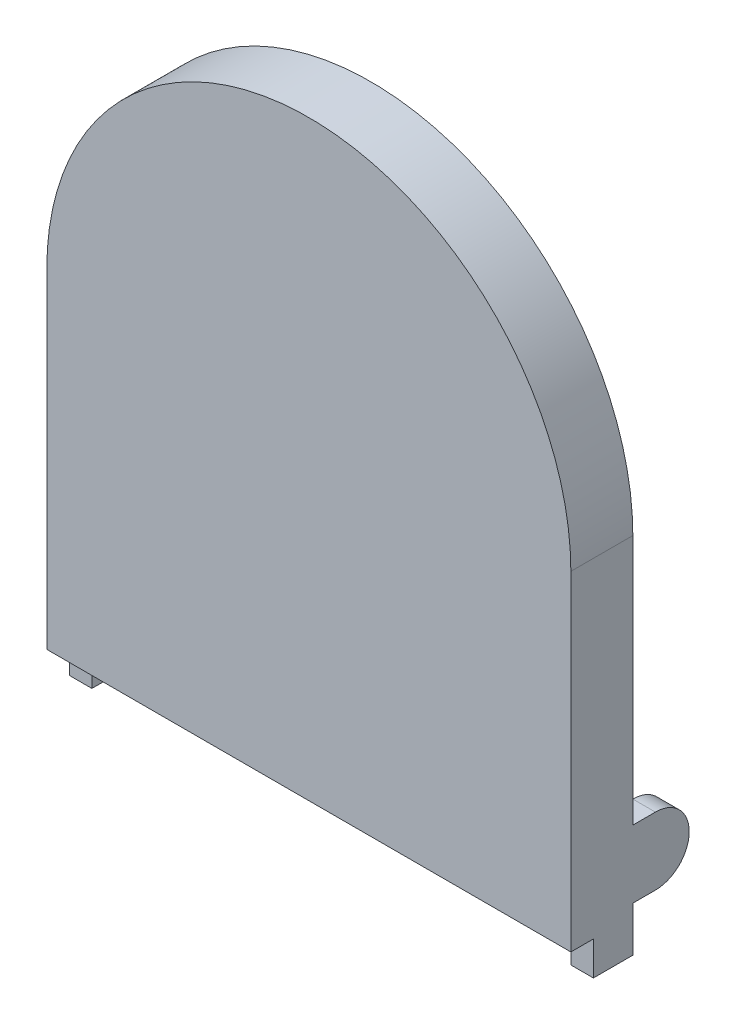
ISO-10303-21;
HEADER;
FILE_DESCRIPTION(('STEP AP214'),'2;1');
FILE_NAME('part.step','',(''),(''),'','','');
FILE_SCHEMA(('AUTOMOTIVE_DESIGN { 1 0 10303 214 1 1 1 1 }'));
ENDSEC;
DATA;
#1=APPLICATION_CONTEXT('core data for automotive mechanical design processes');
#2=APPLICATION_PROTOCOL_DEFINITION('international standard','automotive_design',2000,#1);
#3=PRODUCT_CONTEXT('',#1,'mechanical');
#4=PRODUCT('Part','Part','',(#3));
#5=PRODUCT_RELATED_PRODUCT_CATEGORY('part','',(#4));
#6=PRODUCT_DEFINITION_FORMATION('','',#4);
#7=PRODUCT_DEFINITION_CONTEXT('part definition',#1,'design');
#8=PRODUCT_DEFINITION('design','',#6,#7);
#9=PRODUCT_DEFINITION_SHAPE('','',#8);
#10=(LENGTH_UNIT() NAMED_UNIT(*) SI_UNIT(.MILLI.,.METRE.));
#11=(NAMED_UNIT(*) PLANE_ANGLE_UNIT() SI_UNIT($,.RADIAN.));
#12=(NAMED_UNIT(*) SI_UNIT($,.STERADIAN.) SOLID_ANGLE_UNIT());
#13=UNCERTAINTY_MEASURE_WITH_UNIT(LENGTH_MEASURE(1.E-05),#10,'distance_accuracy_value','');
#14=(GEOMETRIC_REPRESENTATION_CONTEXT(3) GLOBAL_UNCERTAINTY_ASSIGNED_CONTEXT((#13)) GLOBAL_UNIT_ASSIGNED_CONTEXT((#10,
#11,#12)) REPRESENTATION_CONTEXT('',''));
#15=CARTESIAN_POINT('',(0.,0.,0.));
#16=DIRECTION('',(0.,0.,1.));
#17=DIRECTION('',(1.,0.,0.));
#18=AXIS2_PLACEMENT_3D('',#15,#16,#17);
#19=CARTESIAN_POINT('',(21.25,32.25,0.));
#20=DIRECTION('',(0.,0.,-1.));
#21=DIRECTION('',(-1.,0.,0.));
#22=AXIS2_PLACEMENT_3D('',#19,#20,#21);
#23=PLANE('',#22);
#24=DIRECTION('',(0.,1.,0.));
#25=VECTOR('',#24,1.);
#26=CARTESIAN_POINT('',(44.5,0.,0.));
#27=LINE('',#26,#25);
#28=CARTESIAN_POINT('',(44.5,10.,0.));
#29=VERTEX_POINT('',#28);
#30=CARTESIAN_POINT('',(44.5,32.25,0.));
#31=VERTEX_POINT('',#30);
#32=EDGE_CURVE('E204',#29,#31,#27,.T.);
#33=ORIENTED_EDGE('',*,*,#32,.F.);
#34=DIRECTION('',(1.,0.,0.));
#35=VECTOR('',#34,1.);
#36=CARTESIAN_POINT('',(42.5,10.,0.));
#37=LINE('',#36,#35);
#38=CARTESIAN_POINT('',(42.5,10.,0.));
#39=VERTEX_POINT('',#38);
#40=EDGE_CURVE('E52',#39,#29,#37,.T.);
#41=ORIENTED_EDGE('',*,*,#40,.F.);
#42=DIRECTION('',(0.,-1.,0.));
#43=VECTOR('',#42,1.);
#44=CARTESIAN_POINT('',(42.5,0.,0.));
#45=LINE('',#44,#43);
#46=CARTESIAN_POINT('',(42.5,32.25,0.));
#47=VERTEX_POINT('',#46);
#48=EDGE_CURVE('E196',#47,#39,#45,.T.);
#49=ORIENTED_EDGE('',*,*,#48,.F.);
#50=CARTESIAN_POINT('',(21.25,32.25,0.));
#51=DIRECTION('',(0.,0.,-1.));
#52=DIRECTION('',(-1.,0.,0.));
#53=AXIS2_PLACEMENT_3D('',#50,#51,#52);
#54=CIRCLE('',#53,21.25);
#55=CARTESIAN_POINT('',(0.,32.25,0.));
#56=VERTEX_POINT('',#55);
#57=EDGE_CURVE('E197',#56,#47,#54,.T.);
#58=ORIENTED_EDGE('',*,*,#57,.F.);
#59=DIRECTION('',(0.,1.,0.));
#60=VECTOR('',#59,1.);
#61=CARTESIAN_POINT('',(0.,0.,0.));
#62=LINE('',#61,#60);
#63=CARTESIAN_POINT('',(0.,10.,0.));
#64=VERTEX_POINT('',#63);
#65=EDGE_CURVE('E305',#64,#56,#62,.T.);
#66=ORIENTED_EDGE('',*,*,#65,.F.);
#67=DIRECTION('',(-1.,0.,0.));
#68=VECTOR('',#67,1.);
#69=CARTESIAN_POINT('',(0.,10.,0.));
#70=LINE('',#69,#68);
#71=CARTESIAN_POINT('',(-2.,10.,0.));
#72=VERTEX_POINT('',#71);
#73=EDGE_CURVE('E347',#64,#72,#70,.T.);
#74=ORIENTED_EDGE('',*,*,#73,.T.);
#75=DIRECTION('',(0.,-1.,0.));
#76=VECTOR('',#75,1.);
#77=CARTESIAN_POINT('',(-2.,0.,0.));
#78=LINE('',#77,#76);
#79=CARTESIAN_POINT('',(-2.,32.25,0.));
#80=VERTEX_POINT('',#79);
#81=EDGE_CURVE('E211',#80,#72,#78,.T.);
#82=ORIENTED_EDGE('',*,*,#81,.F.);
#83=CARTESIAN_POINT('',(21.25,32.25,0.));
#84=DIRECTION('',(0.,0.,1.));
#85=DIRECTION('',(-1.,0.,0.));
#86=AXIS2_PLACEMENT_3D('',#83,#84,#85);
#87=CIRCLE('',#86,23.25);
#88=EDGE_CURVE('E207',#31,#80,#87,.T.);
#89=ORIENTED_EDGE('',*,*,#88,.F.);
#90=EDGE_LOOP('',(#33,#41,#49,#58,#66,#74,#82,#89));
#91=FACE_BOUND('',#90,.T.);
#92=ADVANCED_FACE('F37',(#91),#23,.T.);
#93=CARTESIAN_POINT('',(42.5,4.,0.));
#94=VERTEX_POINT('',#93);
#95=CARTESIAN_POINT('',(42.5,0.,0.));
#96=VERTEX_POINT('',#95);
#97=EDGE_CURVE('E173',#94,#96,#45,.T.);
#98=ORIENTED_EDGE('',*,*,#97,.F.);
#99=DIRECTION('',(1.,0.,0.));
#100=VECTOR('',#99,1.);
#101=CARTESIAN_POINT('',(42.5,4.,0.));
#102=LINE('',#101,#100);
#103=CARTESIAN_POINT('',(44.5,4.,0.));
#104=VERTEX_POINT('',#103);
#105=EDGE_CURVE('E183',#94,#104,#102,.T.);
#106=ORIENTED_EDGE('',*,*,#105,.T.);
#107=CARTESIAN_POINT('',(44.5,0.,0.));
#108=VERTEX_POINT('',#107);
#109=EDGE_CURVE('E205',#108,#104,#27,.T.);
#110=ORIENTED_EDGE('',*,*,#109,.F.);
#111=DIRECTION('',(1.,0.,0.));
#112=VECTOR('',#111,1.);
#113=CARTESIAN_POINT('',(42.5,0.,0.));
#114=LINE('',#113,#112);
#115=EDGE_CURVE('E195',#96,#108,#114,.T.);
#116=ORIENTED_EDGE('',*,*,#115,.F.);
#117=EDGE_LOOP('',(#98,#106,#110,#116));
#118=FACE_BOUND('',#117,.T.);
#119=ADVANCED_FACE('F194',(#118),#23,.T.);
#120=CARTESIAN_POINT('',(21.25,32.25,3.5));
#121=DIRECTION('',(0.,0.,-1.));
#122=DIRECTION('',(-1.,0.,0.));
#123=AXIS2_PLACEMENT_3D('',#120,#121,#122);
#124=PLANE('',#123);
#125=DIRECTION('',(1.,0.,0.));
#126=VECTOR('',#125,1.);
#127=CARTESIAN_POINT('',(-2.,3.,3.5));
#128=LINE('',#127,#126);
#129=CARTESIAN_POINT('',(-2.,3.,3.5));
#130=VERTEX_POINT('',#129);
#131=CARTESIAN_POINT('',(0.,3.,3.5));
#132=VERTEX_POINT('',#131);
#133=EDGE_CURVE('E334',#130,#132,#128,.T.);
#134=ORIENTED_EDGE('',*,*,#133,.F.);
#135=DIRECTION('',(0.,-1.,0.));
#136=VECTOR('',#135,1.);
#137=CARTESIAN_POINT('',(-2.,0.,3.5));
#138=LINE('',#137,#136);
#139=CARTESIAN_POINT('',(-2.,0.,3.5));
#140=VERTEX_POINT('',#139);
#141=EDGE_CURVE('E219',#130,#140,#138,.T.);
#142=ORIENTED_EDGE('',*,*,#141,.T.);
#143=DIRECTION('',(1.,0.,0.));
#144=VECTOR('',#143,1.);
#145=CARTESIAN_POINT('',(-2.,0.,3.5));
#146=LINE('',#145,#144);
#147=CARTESIAN_POINT('',(0.,0.,3.5));
#148=VERTEX_POINT('',#147);
#149=EDGE_CURVE('E214',#140,#148,#146,.T.);
#150=ORIENTED_EDGE('',*,*,#149,.T.);
#151=DIRECTION('',(0.,1.,0.));
#152=VECTOR('',#151,1.);
#153=CARTESIAN_POINT('',(0.,0.,3.5));
#154=LINE('',#153,#152);
#155=EDGE_CURVE('E322',#148,#132,#154,.T.);
#156=ORIENTED_EDGE('',*,*,#155,.T.);
#157=EDGE_LOOP('',(#134,#142,#150,#156));
#158=FACE_BOUND('',#157,.T.);
#159=ADVANCED_FACE('F269',(#158),#124,.F.);
#160=CARTESIAN_POINT('',(42.5,3.,3.5));
#161=VERTEX_POINT('',#160);
#162=CARTESIAN_POINT('',(44.5,3.,3.5));
#163=VERTEX_POINT('',#162);
#164=EDGE_CURVE('E238',#161,#163,#128,.T.);
#165=ORIENTED_EDGE('',*,*,#164,.F.);
#166=DIRECTION('',(0.,-1.,0.));
#167=VECTOR('',#166,1.);
#168=CARTESIAN_POINT('',(42.5,0.,3.5));
#169=LINE('',#168,#167);
#170=CARTESIAN_POINT('',(42.5,0.,3.5));
#171=VERTEX_POINT('',#170);
#172=EDGE_CURVE('E318',#161,#171,#169,.T.);
#173=ORIENTED_EDGE('',*,*,#172,.T.);
#174=DIRECTION('',(1.,0.,0.));
#175=VECTOR('',#174,1.);
#176=CARTESIAN_POINT('',(42.5,0.,3.5));
#177=LINE('',#176,#175);
#178=CARTESIAN_POINT('',(44.5,0.,3.5));
#179=VERTEX_POINT('',#178);
#180=EDGE_CURVE('E313',#171,#179,#177,.T.);
#181=ORIENTED_EDGE('',*,*,#180,.T.);
#182=DIRECTION('',(0.,1.,0.));
#183=VECTOR('',#182,1.);
#184=CARTESIAN_POINT('',(44.5,0.,3.5));
#185=LINE('',#184,#183);
#186=EDGE_CURVE('E311',#179,#163,#185,.T.);
#187=ORIENTED_EDGE('',*,*,#186,.T.);
#188=EDGE_LOOP('',(#165,#173,#181,#187));
#189=FACE_BOUND('',#188,.T.);
#190=ADVANCED_FACE('F420',(#189),#124,.F.);
#191=CARTESIAN_POINT('',(-2.,0.,3.5));
#192=DIRECTION('',(0.,1.,0.));
#193=DIRECTION('',(0.,0.,1.));
#194=AXIS2_PLACEMENT_3D('',#191,#192,#193);
#195=PLANE('',#194);
#196=DIRECTION('',(1.,0.,0.));
#197=VECTOR('',#196,1.);
#198=CARTESIAN_POINT('',(-2.,0.,0.));
#199=LINE('',#198,#197);
#200=CARTESIAN_POINT('',(-2.,0.,0.));
#201=VERTEX_POINT('',#200);
#202=CARTESIAN_POINT('',(0.,0.,0.));
#203=VERTEX_POINT('',#202);
#204=EDGE_CURVE('E306',#201,#203,#199,.T.);
#205=ORIENTED_EDGE('',*,*,#204,.T.);
#206=DIRECTION('',(0.,0.,-1.));
#207=VECTOR('',#206,1.);
#208=CARTESIAN_POINT('',(0.,0.,3.5));
#209=LINE('',#208,#207);
#210=EDGE_CURVE('E235',#148,#203,#209,.T.);
#211=ORIENTED_EDGE('',*,*,#210,.F.);
#212=ORIENTED_EDGE('',*,*,#149,.F.);
#213=DIRECTION('',(0.,0.,-1.));
#214=VECTOR('',#213,1.);
#215=CARTESIAN_POINT('',(-2.,0.,3.5));
#216=LINE('',#215,#214);
#217=EDGE_CURVE('E215',#140,#201,#216,.T.);
#218=ORIENTED_EDGE('',*,*,#217,.T.);
#219=EDGE_LOOP('',(#205,#211,#212,#218));
#220=FACE_BOUND('',#219,.T.);
#221=ADVANCED_FACE('F425',(#220),#195,.F.);
#222=CARTESIAN_POINT('',(0.,0.,3.5));
#223=DIRECTION('',(-1.,0.,0.));
#224=DIRECTION('',(0.,0.,1.));
#225=AXIS2_PLACEMENT_3D('',#222,#223,#224);
#226=PLANE('',#225);
#227=CARTESIAN_POINT('',(0.,7.,-2.));
#228=DIRECTION('',(-1.,0.,0.));
#229=DIRECTION('',(0.,0.,1.));
#230=AXIS2_PLACEMENT_3D('',#227,#228,#229);
#231=CIRCLE('',#230,1.5);
#232=CARTESIAN_POINT('',(0.,7.,-0.499999999999999));
#233=VERTEX_POINT('',#232);
#234=EDGE_CURVE('E239',#233,#233,#231,.F.);
#235=ORIENTED_EDGE('',*,*,#234,.F.);
#236=EDGE_LOOP('',(#235));
#237=FACE_BOUND('',#236,.T.);
#238=DIRECTION('',(0.,0.,-1.));
#239=VECTOR('',#238,1.);
#240=CARTESIAN_POINT('',(0.,10.,0.));
#241=LINE('',#240,#239);
#242=CARTESIAN_POINT('',(0.,10.,-2.));
#243=VERTEX_POINT('',#242);
#244=EDGE_CURVE('E354',#64,#243,#241,.T.);
#245=ORIENTED_EDGE('',*,*,#244,.F.);
#246=ORIENTED_EDGE('',*,*,#65,.T.);
#247=DIRECTION('',(0.,0.,-1.));
#248=VECTOR('',#247,1.);
#249=CARTESIAN_POINT('',(0.,32.25,3.5));
#250=LINE('',#249,#248);
#251=CARTESIAN_POINT('',(0.,32.25,3.5));
#252=VERTEX_POINT('',#251);
#253=EDGE_CURVE('E232',#252,#56,#250,.T.);
#254=ORIENTED_EDGE('',*,*,#253,.F.);
#255=EDGE_CURVE('E325',#132,#252,#154,.T.);
#256=ORIENTED_EDGE('',*,*,#255,.F.);
#257=ORIENTED_EDGE('',*,*,#155,.F.);
#258=ORIENTED_EDGE('',*,*,#210,.T.);
#259=CARTESIAN_POINT('',(0.,4.,0.));
#260=VERTEX_POINT('',#259);
#261=EDGE_CURVE('E199',#203,#260,#62,.T.);
#262=ORIENTED_EDGE('',*,*,#261,.T.);
#263=DIRECTION('',(0.,0.,1.));
#264=VECTOR('',#263,1.);
#265=CARTESIAN_POINT('',(0.,4.,0.));
#266=LINE('',#265,#264);
#267=CARTESIAN_POINT('',(0.,4.,-2.));
#268=VERTEX_POINT('',#267);
#269=EDGE_CURVE('E302',#268,#260,#266,.T.);
#270=ORIENTED_EDGE('',*,*,#269,.F.);
#271=CARTESIAN_POINT('',(0.,7.,-2.));
#272=DIRECTION('',(-1.,0.,0.));
#273=DIRECTION('',(0.,0.,-1.));
#274=AXIS2_PLACEMENT_3D('',#271,#272,#273);
#275=CIRCLE('',#274,3.);
#276=EDGE_CURVE('E360',#243,#268,#275,.T.);
#277=ORIENTED_EDGE('',*,*,#276,.F.);
#278=EDGE_LOOP('',(#245,#246,#254,#256,#257,#258,#262,#270,#277));
#279=FACE_BOUND('',#278,.T.);
#280=ADVANCED_FACE('F300',(#237,#279),#226,.F.);
#281=CARTESIAN_POINT('',(21.25,32.25,3.5));
#282=DIRECTION('',(0.,0.,-1.));
#283=DIRECTION('',(-1.,0.,0.));
#284=AXIS2_PLACEMENT_3D('',#281,#282,#283);
#285=CYLINDRICAL_SURFACE('',#284,21.25);
#286=ORIENTED_EDGE('',*,*,#57,.T.);
#287=DIRECTION('',(0.,0.,-1.));
#288=VECTOR('',#287,1.);
#289=CARTESIAN_POINT('',(42.5,32.25,3.5));
#290=LINE('',#289,#288);
#291=CARTESIAN_POINT('',(42.5,32.25,3.5));
#292=VERTEX_POINT('',#291);
#293=EDGE_CURVE('E229',#292,#47,#290,.T.);
#294=ORIENTED_EDGE('',*,*,#293,.F.);
#295=CARTESIAN_POINT('',(21.25,32.25,3.5));
#296=DIRECTION('',(0.,0.,-1.));
#297=DIRECTION('',(-1.,0.,0.));
#298=AXIS2_PLACEMENT_3D('',#295,#296,#297);
#299=CIRCLE('',#298,21.25);
#300=EDGE_CURVE('E319',#252,#292,#299,.T.);
#301=ORIENTED_EDGE('',*,*,#300,.F.);
#302=ORIENTED_EDGE('',*,*,#253,.T.);
#303=EDGE_LOOP('',(#286,#294,#301,#302));
#304=FACE_BOUND('',#303,.T.);
#305=ADVANCED_FACE('F450',(#304),#285,.F.);
#306=CARTESIAN_POINT('',(42.5,0.,3.5));
#307=DIRECTION('',(1.,0.,0.));
#308=DIRECTION('',(0.,0.,-1.));
#309=AXIS2_PLACEMENT_3D('',#306,#307,#308);
#310=PLANE('',#309);
#311=CARTESIAN_POINT('',(42.5,7.,-2.));
#312=DIRECTION('',(1.,0.,0.));
#313=DIRECTION('',(0.,0.,-1.));
#314=AXIS2_PLACEMENT_3D('',#311,#312,#313);
#315=CIRCLE('',#314,1.5);
#316=CARTESIAN_POINT('',(42.5,7.,-3.5));
#317=VERTEX_POINT('',#316);
#318=EDGE_CURVE('E374',#317,#317,#315,.T.);
#319=ORIENTED_EDGE('',*,*,#318,.T.);
#320=EDGE_LOOP('',(#319));
#321=FACE_BOUND('',#320,.T.);
#322=ORIENTED_EDGE('',*,*,#48,.T.);
#323=DIRECTION('',(0.,0.,-1.));
#324=VECTOR('',#323,1.);
#325=CARTESIAN_POINT('',(42.5,10.,0.));
#326=LINE('',#325,#324);
#327=CARTESIAN_POINT('',(42.5,10.,-2.));
#328=VERTEX_POINT('',#327);
#329=EDGE_CURVE('E191',#39,#328,#326,.T.);
#330=ORIENTED_EDGE('',*,*,#329,.T.);
#331=CARTESIAN_POINT('',(42.5,7.,-2.));
#332=DIRECTION('',(-1.,0.,0.));
#333=DIRECTION('',(0.,0.,-1.));
#334=AXIS2_PLACEMENT_3D('',#331,#332,#333);
#335=CIRCLE('',#334,3.);
#336=CARTESIAN_POINT('',(42.5,4.,-2.));
#337=VERTEX_POINT('',#336);
#338=EDGE_CURVE('E176',#328,#337,#335,.T.);
#339=ORIENTED_EDGE('',*,*,#338,.T.);
#340=DIRECTION('',(0.,0.,1.));
#341=VECTOR('',#340,1.);
#342=CARTESIAN_POINT('',(42.5,4.,0.));
#343=LINE('',#342,#341);
#344=EDGE_CURVE('E167',#337,#94,#343,.T.);
#345=ORIENTED_EDGE('',*,*,#344,.T.);
#346=ORIENTED_EDGE('',*,*,#97,.T.);
#347=DIRECTION('',(0.,0.,-1.));
#348=VECTOR('',#347,1.);
#349=CARTESIAN_POINT('',(42.5,0.,3.5));
#350=LINE('',#349,#348);
#351=EDGE_CURVE('E227',#171,#96,#350,.T.);
#352=ORIENTED_EDGE('',*,*,#351,.F.);
#353=ORIENTED_EDGE('',*,*,#172,.F.);
#354=EDGE_CURVE('E315',#292,#161,#169,.T.);
#355=ORIENTED_EDGE('',*,*,#354,.F.);
#356=ORIENTED_EDGE('',*,*,#293,.T.);
#357=EDGE_LOOP('',(#322,#330,#339,#345,#346,#352,#353,#355,#356));
#358=FACE_BOUND('',#357,.T.);
#359=ADVANCED_FACE('F170',(#321,#358),#310,.F.);
#360=CARTESIAN_POINT('',(42.5,0.,3.5));
#361=DIRECTION('',(0.,1.,0.));
#362=DIRECTION('',(0.,0.,1.));
#363=AXIS2_PLACEMENT_3D('',#360,#361,#362);
#364=PLANE('',#363);
#365=ORIENTED_EDGE('',*,*,#115,.T.);
#366=DIRECTION('',(0.,0.,-1.));
#367=VECTOR('',#366,1.);
#368=CARTESIAN_POINT('',(44.5,0.,3.5));
#369=LINE('',#368,#367);
#370=EDGE_CURVE('E224',#179,#108,#369,.T.);
#371=ORIENTED_EDGE('',*,*,#370,.F.);
#372=ORIENTED_EDGE('',*,*,#180,.F.);
#373=ORIENTED_EDGE('',*,*,#351,.T.);
#374=EDGE_LOOP('',(#365,#371,#372,#373));
#375=FACE_BOUND('',#374,.T.);
#376=ADVANCED_FACE('F508',(#375),#364,.F.);
#377=CARTESIAN_POINT('',(44.5,0.,3.5));
#378=DIRECTION('',(-1.,0.,0.));
#379=DIRECTION('',(0.,-1.,0.));
#380=AXIS2_PLACEMENT_3D('',#377,#378,#379);
#381=PLANE('',#380);
#382=ORIENTED_EDGE('',*,*,#109,.T.);
#383=DIRECTION('',(0.,0.,1.));
#384=VECTOR('',#383,1.);
#385=CARTESIAN_POINT('',(44.5,4.,0.));
#386=LINE('',#385,#384);
#387=CARTESIAN_POINT('',(44.5,4.,-2.));
#388=VERTEX_POINT('',#387);
#389=EDGE_CURVE('E186',#388,#104,#386,.T.);
#390=ORIENTED_EDGE('',*,*,#389,.F.);
#391=CARTESIAN_POINT('',(44.5,7.,-2.));
#392=DIRECTION('',(-1.,0.,0.));
#393=DIRECTION('',(0.,0.,-1.));
#394=AXIS2_PLACEMENT_3D('',#391,#392,#393);
#395=CIRCLE('',#394,3.);
#396=CARTESIAN_POINT('',(44.5,10.,-2.));
#397=VERTEX_POINT('',#396);
#398=EDGE_CURVE('E371',#397,#388,#395,.T.);
#399=ORIENTED_EDGE('',*,*,#398,.F.);
#400=DIRECTION('',(0.,0.,-1.));
#401=VECTOR('',#400,1.);
#402=CARTESIAN_POINT('',(44.5,10.,0.));
#403=LINE('',#402,#401);
#404=EDGE_CURVE('E180',#29,#397,#403,.T.);
#405=ORIENTED_EDGE('',*,*,#404,.F.);
#406=ORIENTED_EDGE('',*,*,#32,.T.);
#407=DIRECTION('',(0.,0.,-1.));
#408=VECTOR('',#407,1.);
#409=CARTESIAN_POINT('',(44.5,32.25,3.5));
#410=LINE('',#409,#408);
#411=CARTESIAN_POINT('',(44.5,32.25,5.5));
#412=VERTEX_POINT('',#411);
#413=EDGE_CURVE('E221',#412,#31,#410,.T.);
#414=ORIENTED_EDGE('',*,*,#413,.F.);
#415=DIRECTION('',(0.,1.,0.));
#416=VECTOR('',#415,1.);
#417=CARTESIAN_POINT('',(44.5,3.,5.5));
#418=LINE('',#417,#416);
#419=CARTESIAN_POINT('',(44.5,3.,5.5));
#420=VERTEX_POINT('',#419);
#421=EDGE_CURVE('E340',#420,#412,#418,.T.);
#422=ORIENTED_EDGE('',*,*,#421,.F.);
#423=DIRECTION('',(0.,0.,-1.));
#424=VECTOR('',#423,1.);
#425=CARTESIAN_POINT('',(44.5,3.,5.5));
#426=LINE('',#425,#424);
#427=EDGE_CURVE('E330',#420,#163,#426,.T.);
#428=ORIENTED_EDGE('',*,*,#427,.T.);
#429=ORIENTED_EDGE('',*,*,#186,.F.);
#430=ORIENTED_EDGE('',*,*,#370,.T.);
#431=EDGE_LOOP('',(#382,#390,#399,#405,#406,#414,#422,#428,#429,#430));
#432=FACE_BOUND('',#431,.T.);
#433=ADVANCED_FACE('F501',(#432),#381,.F.);
#434=CARTESIAN_POINT('',(21.25,32.25,3.5));
#435=DIRECTION('',(0.,0.,-1.));
#436=DIRECTION('',(-1.,0.,0.));
#437=AXIS2_PLACEMENT_3D('',#434,#435,#436);
#438=CYLINDRICAL_SURFACE('',#437,23.25);
#439=ORIENTED_EDGE('',*,*,#88,.T.);
#440=DIRECTION('',(0.,0.,-1.));
#441=VECTOR('',#440,1.);
#442=CARTESIAN_POINT('',(-2.,32.25,3.5));
#443=LINE('',#442,#441);
#444=CARTESIAN_POINT('',(-2.,32.25,5.5));
#445=VERTEX_POINT('',#444);
#446=EDGE_CURVE('E218',#445,#80,#443,.T.);
#447=ORIENTED_EDGE('',*,*,#446,.F.);
#448=CARTESIAN_POINT('',(21.25,32.25,5.5));
#449=DIRECTION('',(0.,0.,1.));
#450=DIRECTION('',(-1.,0.,0.));
#451=AXIS2_PLACEMENT_3D('',#448,#449,#450);
#452=CIRCLE('',#451,23.25);
#453=EDGE_CURVE('E333',#412,#445,#452,.T.);
#454=ORIENTED_EDGE('',*,*,#453,.F.);
#455=ORIENTED_EDGE('',*,*,#413,.T.);
#456=EDGE_LOOP('',(#439,#447,#454,#455));
#457=FACE_BOUND('',#456,.T.);
#458=ADVANCED_FACE('F284',(#457),#438,.T.);
#459=CARTESIAN_POINT('',(-2.,0.,3.5));
#460=DIRECTION('',(1.,0.,0.));
#461=DIRECTION('',(0.,0.,-1.));
#462=AXIS2_PLACEMENT_3D('',#459,#460,#461);
#463=PLANE('',#462);
#464=DIRECTION('',(0.,0.,1.));
#465=VECTOR('',#464,1.);
#466=CARTESIAN_POINT('',(-2.,4.,0.));
#467=LINE('',#466,#465);
#468=CARTESIAN_POINT('',(-2.,4.,-2.));
#469=VERTEX_POINT('',#468);
#470=CARTESIAN_POINT('',(-2.,4.,0.));
#471=VERTEX_POINT('',#470);
#472=EDGE_CURVE('E352',#469,#471,#467,.T.);
#473=ORIENTED_EDGE('',*,*,#472,.T.);
#474=EDGE_CURVE('E210',#471,#201,#78,.T.);
#475=ORIENTED_EDGE('',*,*,#474,.T.);
#476=ORIENTED_EDGE('',*,*,#217,.F.);
#477=ORIENTED_EDGE('',*,*,#141,.F.);
#478=DIRECTION('',(0.,0.,-1.));
#479=VECTOR('',#478,1.);
#480=CARTESIAN_POINT('',(-2.,3.,5.5));
#481=LINE('',#480,#479);
#482=CARTESIAN_POINT('',(-2.,3.,5.5));
#483=VERTEX_POINT('',#482);
#484=EDGE_CURVE('E309',#483,#130,#481,.T.);
#485=ORIENTED_EDGE('',*,*,#484,.F.);
#486=DIRECTION('',(0.,-1.,0.));
#487=VECTOR('',#486,1.);
#488=CARTESIAN_POINT('',(-2.,3.,5.5));
#489=LINE('',#488,#487);
#490=EDGE_CURVE('E337',#445,#483,#489,.T.);
#491=ORIENTED_EDGE('',*,*,#490,.F.);
#492=ORIENTED_EDGE('',*,*,#446,.T.);
#493=ORIENTED_EDGE('',*,*,#81,.T.);
#494=DIRECTION('',(0.,0.,-1.));
#495=VECTOR('',#494,1.);
#496=CARTESIAN_POINT('',(-2.,10.,0.));
#497=LINE('',#496,#495);
#498=CARTESIAN_POINT('',(-2.,10.,-2.));
#499=VERTEX_POINT('',#498);
#500=EDGE_CURVE('E60',#72,#499,#497,.T.);
#501=ORIENTED_EDGE('',*,*,#500,.T.);
#502=CARTESIAN_POINT('',(-2.,7.,-2.));
#503=DIRECTION('',(-1.,0.,0.));
#504=DIRECTION('',(0.,0.,-1.));
#505=AXIS2_PLACEMENT_3D('',#502,#503,#504);
#506=CIRCLE('',#505,3.);
#507=EDGE_CURVE('E355',#499,#469,#506,.T.);
#508=ORIENTED_EDGE('',*,*,#507,.T.);
#509=EDGE_LOOP('',(#473,#475,#476,#477,#485,#491,#492,#493,#501,#508));
#510=FACE_BOUND('',#509,.T.);
#511=ADVANCED_FACE('F275',(#510),#463,.F.);
#512=DIRECTION('',(-1.,0.,0.));
#513=VECTOR('',#512,1.);
#514=CARTESIAN_POINT('',(0.,4.,0.));
#515=LINE('',#514,#513);
#516=EDGE_CURVE('E288',#260,#471,#515,.T.);
#517=ORIENTED_EDGE('',*,*,#516,.F.);
#518=ORIENTED_EDGE('',*,*,#261,.F.);
#519=ORIENTED_EDGE('',*,*,#204,.F.);
#520=ORIENTED_EDGE('',*,*,#474,.F.);
#521=EDGE_LOOP('',(#517,#518,#519,#520));
#522=FACE_BOUND('',#521,.T.);
#523=ADVANCED_FACE('F265',(#522),#23,.T.);
#524=CARTESIAN_POINT('',(-2.,3.,5.5));
#525=DIRECTION('',(0.,1.,0.));
#526=DIRECTION('',(-1.,0.,0.));
#527=AXIS2_PLACEMENT_3D('',#524,#525,#526);
#528=PLANE('',#527);
#529=ORIENTED_EDGE('',*,*,#133,.T.);
#530=EDGE_CURVE('E294',#132,#161,#128,.T.);
#531=ORIENTED_EDGE('',*,*,#530,.T.);
#532=ORIENTED_EDGE('',*,*,#164,.T.);
#533=ORIENTED_EDGE('',*,*,#427,.F.);
#534=DIRECTION('',(1.,0.,0.));
#535=VECTOR('',#534,1.);
#536=CARTESIAN_POINT('',(-2.,3.,5.5));
#537=LINE('',#536,#535);
#538=EDGE_CURVE('E343',#483,#420,#537,.T.);
#539=ORIENTED_EDGE('',*,*,#538,.F.);
#540=ORIENTED_EDGE('',*,*,#484,.T.);
#541=EDGE_LOOP('',(#529,#531,#532,#533,#539,#540));
#542=FACE_BOUND('',#541,.T.);
#543=ADVANCED_FACE('F274',(#542),#528,.F.);
#544=CARTESIAN_POINT('',(21.25,32.25,5.5));
#545=DIRECTION('',(0.,0.,-1.));
#546=DIRECTION('',(-1.,0.,0.));
#547=AXIS2_PLACEMENT_3D('',#544,#545,#546);
#548=PLANE('',#547);
#549=ORIENTED_EDGE('',*,*,#490,.T.);
#550=ORIENTED_EDGE('',*,*,#538,.T.);
#551=ORIENTED_EDGE('',*,*,#421,.T.);
#552=ORIENTED_EDGE('',*,*,#453,.T.);
#553=EDGE_LOOP('',(#549,#550,#551,#552));
#554=FACE_BOUND('',#553,.T.);
#555=ADVANCED_FACE('F281',(#554),#548,.F.);
#556=CARTESIAN_POINT('',(21.25,32.25,3.5));
#557=DIRECTION('',(0.,0.,-1.));
#558=DIRECTION('',(-1.,0.,0.));
#559=AXIS2_PLACEMENT_3D('',#556,#557,#558);
#560=PLANE('',#559);
#561=ORIENTED_EDGE('',*,*,#530,.F.);
#562=ORIENTED_EDGE('',*,*,#255,.T.);
#563=ORIENTED_EDGE('',*,*,#300,.T.);
#564=ORIENTED_EDGE('',*,*,#354,.T.);
#565=EDGE_LOOP('',(#561,#562,#563,#564));
#566=FACE_BOUND('',#565,.T.);
#567=ADVANCED_FACE('F408',(#566),#560,.T.);
#568=CARTESIAN_POINT('',(0.,4.,0.));
#569=DIRECTION('',(0.,-1.,0.));
#570=DIRECTION('',(0.,0.,-1.));
#571=AXIS2_PLACEMENT_3D('',#568,#569,#570);
#572=PLANE('',#571);
#573=ORIENTED_EDGE('',*,*,#472,.F.);
#574=DIRECTION('',(-1.,0.,0.));
#575=VECTOR('',#574,1.);
#576=CARTESIAN_POINT('',(0.,4.,-2.));
#577=LINE('',#576,#575);
#578=EDGE_CURVE('E295',#268,#469,#577,.T.);
#579=ORIENTED_EDGE('',*,*,#578,.F.);
#580=ORIENTED_EDGE('',*,*,#269,.T.);
#581=ORIENTED_EDGE('',*,*,#516,.T.);
#582=EDGE_LOOP('',(#573,#579,#580,#581));
#583=FACE_BOUND('',#582,.T.);
#584=ADVANCED_FACE('F404',(#583),#572,.T.);
#585=CARTESIAN_POINT('',(0.,7.,-2.));
#586=DIRECTION('',(-1.,0.,0.));
#587=DIRECTION('',(0.,0.,1.));
#588=AXIS2_PLACEMENT_3D('',#585,#586,#587);
#589=CYLINDRICAL_SURFACE('',#588,3.);
#590=ORIENTED_EDGE('',*,*,#507,.F.);
#591=DIRECTION('',(-1.,0.,0.));
#592=VECTOR('',#591,1.);
#593=CARTESIAN_POINT('',(0.,10.,-2.));
#594=LINE('',#593,#592);
#595=EDGE_CURVE('E349',#243,#499,#594,.T.);
#596=ORIENTED_EDGE('',*,*,#595,.F.);
#597=ORIENTED_EDGE('',*,*,#276,.T.);
#598=ORIENTED_EDGE('',*,*,#578,.T.);
#599=EDGE_LOOP('',(#590,#596,#597,#598));
#600=FACE_BOUND('',#599,.T.);
#601=ADVANCED_FACE('F407',(#600),#589,.T.);
#602=CARTESIAN_POINT('',(0.,10.,0.));
#603=DIRECTION('',(0.,1.,0.));
#604=DIRECTION('',(0.,0.,1.));
#605=AXIS2_PLACEMENT_3D('',#602,#603,#604);
#606=PLANE('',#605);
#607=ORIENTED_EDGE('',*,*,#500,.F.);
#608=ORIENTED_EDGE('',*,*,#73,.F.);
#609=ORIENTED_EDGE('',*,*,#244,.T.);
#610=ORIENTED_EDGE('',*,*,#595,.T.);
#611=EDGE_LOOP('',(#607,#608,#609,#610));
#612=FACE_BOUND('',#611,.T.);
#613=ADVANCED_FACE('F402',(#612),#606,.T.);
#614=CARTESIAN_POINT('',(1.5,7.,-2.));
#615=DIRECTION('',(-1.,0.,0.));
#616=DIRECTION('',(0.,0.,1.));
#617=AXIS2_PLACEMENT_3D('',#614,#615,#616);
#618=CYLINDRICAL_SURFACE('',#617,1.5);
#619=CARTESIAN_POINT('',(0.5,7.,-2.));
#620=DIRECTION('',(1.,0.,0.));
#621=DIRECTION('',(0.,0.,-1.));
#622=AXIS2_PLACEMENT_3D('',#619,#620,#621);
#623=CIRCLE('',#622,1.5);
#624=CARTESIAN_POINT('',(0.5,7.,-3.5));
#625=VERTEX_POINT('',#624);
#626=EDGE_CURVE('E245',#625,#625,#623,.F.);
#627=ORIENTED_EDGE('',*,*,#626,.T.);
#628=EDGE_LOOP('',(#627));
#629=FACE_BOUND('',#628,.T.);
#630=ORIENTED_EDGE('',*,*,#234,.T.);
#631=EDGE_LOOP('',(#630));
#632=FACE_BOUND('',#631,.T.);
#633=ADVANCED_FACE('F398',(#629,#632),#618,.T.);
#634=CARTESIAN_POINT('',(1.5,7.,-2.));
#635=DIRECTION('',(1.,0.,0.));
#636=DIRECTION('',(0.,0.,-1.));
#637=AXIS2_PLACEMENT_3D('',#634,#635,#636);
#638=PLANE('',#637);
#639=CARTESIAN_POINT('',(1.5,7.,-2.));
#640=DIRECTION('',(1.,0.,0.));
#641=DIRECTION('',(0.,0.,-1.));
#642=AXIS2_PLACEMENT_3D('',#639,#640,#641);
#643=CIRCLE('',#642,0.5);
#644=CARTESIAN_POINT('',(1.5,7.,-2.5));
#645=VERTEX_POINT('',#644);
#646=EDGE_CURVE('E242',#645,#645,#643,.T.);
#647=ORIENTED_EDGE('',*,*,#646,.T.);
#648=EDGE_LOOP('',(#647));
#649=FACE_BOUND('',#648,.T.);
#650=ADVANCED_FACE('F395',(#649),#638,.T.);
#651=CARTESIAN_POINT('',(0.5,7.,-2.));
#652=DIRECTION('',(1.,0.,0.));
#653=DIRECTION('',(0.,0.,-1.));
#654=AXIS2_PLACEMENT_3D('',#651,#652,#653);
#655=DEGENERATE_TOROIDAL_SURFACE('',#654,0.5,1.,.T.);
#656=ORIENTED_EDGE('',*,*,#626,.F.);
#657=EDGE_LOOP('',(#656));
#658=FACE_BOUND('',#657,.T.);
#659=ORIENTED_EDGE('',*,*,#646,.F.);
#660=EDGE_LOOP('',(#659));
#661=FACE_BOUND('',#660,.T.);
#662=ADVANCED_FACE('F391',(#658,#661),#655,.T.);
#663=CARTESIAN_POINT('',(42.5,10.,0.));
#664=DIRECTION('',(0.,-1.,0.));
#665=DIRECTION('',(0.,0.,-1.));
#666=AXIS2_PLACEMENT_3D('',#663,#664,#665);
#667=PLANE('',#666);
#668=ORIENTED_EDGE('',*,*,#404,.T.);
#669=DIRECTION('',(1.,0.,0.));
#670=VECTOR('',#669,1.);
#671=CARTESIAN_POINT('',(42.5,10.,-2.));
#672=LINE('',#671,#670);
#673=EDGE_CURVE('E366',#328,#397,#672,.T.);
#674=ORIENTED_EDGE('',*,*,#673,.F.);
#675=ORIENTED_EDGE('',*,*,#329,.F.);
#676=ORIENTED_EDGE('',*,*,#40,.T.);
#677=EDGE_LOOP('',(#668,#674,#675,#676));
#678=FACE_BOUND('',#677,.T.);
#679=ADVANCED_FACE('F388',(#678),#667,.F.);
#680=CARTESIAN_POINT('',(42.5,7.,-2.));
#681=DIRECTION('',(1.,0.,0.));
#682=DIRECTION('',(0.,0.,-1.));
#683=AXIS2_PLACEMENT_3D('',#680,#681,#682);
#684=CYLINDRICAL_SURFACE('',#683,3.);
#685=ORIENTED_EDGE('',*,*,#398,.T.);
#686=DIRECTION('',(1.,0.,0.));
#687=VECTOR('',#686,1.);
#688=CARTESIAN_POINT('',(42.5,4.,-2.));
#689=LINE('',#688,#687);
#690=EDGE_CURVE('E190',#337,#388,#689,.T.);
#691=ORIENTED_EDGE('',*,*,#690,.F.);
#692=ORIENTED_EDGE('',*,*,#338,.F.);
#693=ORIENTED_EDGE('',*,*,#673,.T.);
#694=EDGE_LOOP('',(#685,#691,#692,#693));
#695=FACE_BOUND('',#694,.T.);
#696=ADVANCED_FACE('F385',(#695),#684,.T.);
#697=CARTESIAN_POINT('',(42.5,4.,0.));
#698=DIRECTION('',(0.,1.,0.));
#699=DIRECTION('',(0.,0.,1.));
#700=AXIS2_PLACEMENT_3D('',#697,#698,#699);
#701=PLANE('',#700);
#702=ORIENTED_EDGE('',*,*,#389,.T.);
#703=ORIENTED_EDGE('',*,*,#105,.F.);
#704=ORIENTED_EDGE('',*,*,#344,.F.);
#705=ORIENTED_EDGE('',*,*,#690,.T.);
#706=EDGE_LOOP('',(#702,#703,#704,#705));
#707=FACE_BOUND('',#706,.T.);
#708=ADVANCED_FACE('F184',(#707),#701,.F.);
#709=CARTESIAN_POINT('',(41.,7.,-2.));
#710=DIRECTION('',(1.,0.,0.));
#711=DIRECTION('',(0.,0.,-1.));
#712=AXIS2_PLACEMENT_3D('',#709,#710,#711);
#713=CYLINDRICAL_SURFACE('',#712,1.5);
#714=CARTESIAN_POINT('',(42.,7.,-2.));
#715=DIRECTION('',(-1.,0.,0.));
#716=DIRECTION('',(0.,0.,1.));
#717=AXIS2_PLACEMENT_3D('',#714,#715,#716);
#718=CIRCLE('',#717,1.5);
#719=CARTESIAN_POINT('',(42.,7.,-0.499999999999999));
#720=VERTEX_POINT('',#719);
#721=EDGE_CURVE('E45',#720,#720,#718,.F.);
#722=ORIENTED_EDGE('',*,*,#721,.T.);
#723=EDGE_LOOP('',(#722));
#724=FACE_BOUND('',#723,.T.);
#725=ORIENTED_EDGE('',*,*,#318,.F.);
#726=EDGE_LOOP('',(#725));
#727=FACE_BOUND('',#726,.T.);
#728=ADVANCED_FACE('F250',(#724,#727),#713,.T.);
#729=CARTESIAN_POINT('',(41.,7.,-2.));
#730=DIRECTION('',(-1.,0.,0.));
#731=DIRECTION('',(0.,0.,-1.));
#732=AXIS2_PLACEMENT_3D('',#729,#730,#731);
#733=PLANE('',#732);
#734=CARTESIAN_POINT('',(41.,7.,-2.));
#735=DIRECTION('',(-1.,0.,0.));
#736=DIRECTION('',(0.,0.,1.));
#737=AXIS2_PLACEMENT_3D('',#734,#735,#736);
#738=CIRCLE('',#737,0.5);
#739=CARTESIAN_POINT('',(41.,7.,-1.5));
#740=VERTEX_POINT('',#739);
#741=EDGE_CURVE('E11',#740,#740,#738,.T.);
#742=ORIENTED_EDGE('',*,*,#741,.T.);
#743=EDGE_LOOP('',(#742));
#744=FACE_BOUND('',#743,.T.);
#745=ADVANCED_FACE('F254',(#744),#733,.T.);
#746=CARTESIAN_POINT('',(42.,7.,-2.));
#747=DIRECTION('',(-1.,0.,0.));
#748=DIRECTION('',(0.,0.,1.));
#749=AXIS2_PLACEMENT_3D('',#746,#747,#748);
#750=DEGENERATE_TOROIDAL_SURFACE('',#749,0.5,1.,.T.);
#751=ORIENTED_EDGE('',*,*,#741,.F.);
#752=EDGE_LOOP('',(#751));
#753=FACE_BOUND('',#752,.T.);
#754=ORIENTED_EDGE('',*,*,#721,.F.);
#755=EDGE_LOOP('',(#754));
#756=FACE_BOUND('',#755,.T.);
#757=ADVANCED_FACE('F39',(#753,#756),#750,.T.);
#758=CLOSED_SHELL('',(#92,#119,#159,#190,#221,#280,#305,#359,#376,#433,#458,#511,#523,#543,#555,
#567,#584,#601,#613,#633,#650,#662,#679,#696,#708,#728,#745,#757));
#759=MANIFOLD_SOLID_BREP('B2',#758);
#760=ADVANCED_BREP_SHAPE_REPRESENTATION('',(#18,#759),#14);
#761=SHAPE_DEFINITION_REPRESENTATION(#9,#760);
ENDSEC;
END-ISO-10303-21;
